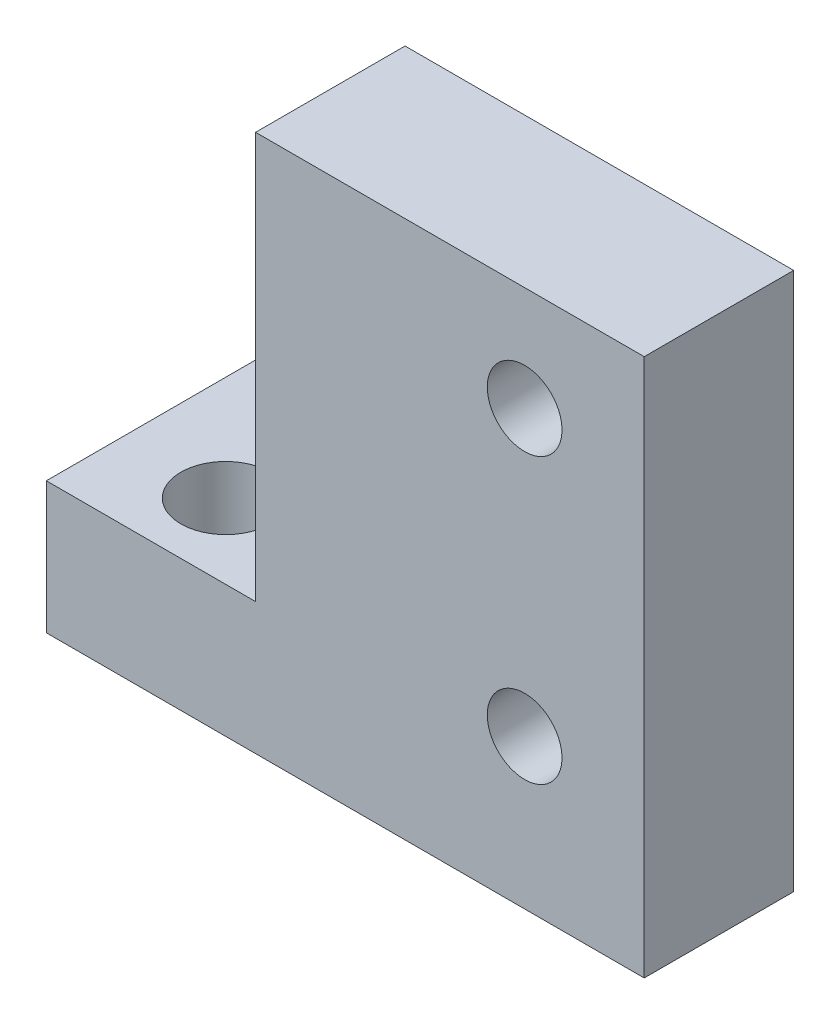
ISO-10303-21;
HEADER;
FILE_DESCRIPTION(('STEP AP214'),'2;1');
FILE_NAME('part.step','',(''),(''),'','','');
FILE_SCHEMA(('AUTOMOTIVE_DESIGN { 1 0 10303 214 1 1 1 1 }'));
ENDSEC;
DATA;
#1=APPLICATION_CONTEXT('core data for automotive mechanical design processes');
#2=APPLICATION_PROTOCOL_DEFINITION('international standard','automotive_design',2000,#1);
#3=PRODUCT_CONTEXT('',#1,'mechanical');
#4=PRODUCT('Part','Part','',(#3));
#5=PRODUCT_RELATED_PRODUCT_CATEGORY('part','',(#4));
#6=PRODUCT_DEFINITION_FORMATION('','',#4);
#7=PRODUCT_DEFINITION_CONTEXT('part definition',#1,'design');
#8=PRODUCT_DEFINITION('design','',#6,#7);
#9=PRODUCT_DEFINITION_SHAPE('','',#8);
#10=(LENGTH_UNIT() NAMED_UNIT(*) SI_UNIT(.MILLI.,.METRE.));
#11=(NAMED_UNIT(*) PLANE_ANGLE_UNIT() SI_UNIT($,.RADIAN.));
#12=(NAMED_UNIT(*) SI_UNIT($,.STERADIAN.) SOLID_ANGLE_UNIT());
#13=UNCERTAINTY_MEASURE_WITH_UNIT(LENGTH_MEASURE(1.E-05),#10,'distance_accuracy_value','');
#14=(GEOMETRIC_REPRESENTATION_CONTEXT(3) GLOBAL_UNCERTAINTY_ASSIGNED_CONTEXT((#13)) GLOBAL_UNIT_ASSIGNED_CONTEXT((#10,
#11,#12)) REPRESENTATION_CONTEXT('',''));
#15=CARTESIAN_POINT('',(0.,0.,0.));
#16=DIRECTION('',(0.,0.,1.));
#17=DIRECTION('',(1.,0.,0.));
#18=AXIS2_PLACEMENT_3D('',#15,#16,#17);
#19=CARTESIAN_POINT('',(0.,18.,0.));
#20=DIRECTION('',(-1.,0.,0.));
#21=DIRECTION('',(0.,0.,1.));
#22=AXIS2_PLACEMENT_3D('',#19,#20,#21);
#23=PLANE('',#22);
#24=DIRECTION('',(0.,0.,-1.));
#25=VECTOR('',#24,1.);
#26=CARTESIAN_POINT('',(0.,4.40436135801292,0.));
#27=LINE('',#26,#25);
#28=CARTESIAN_POINT('',(0.,4.40436135801292,-3.3180339887499));
#29=VERTEX_POINT('',#28);
#30=CARTESIAN_POINT('',(0.,4.40436135801292,-6.));
#31=VERTEX_POINT('',#30);
#32=EDGE_CURVE('E173',#29,#31,#27,.T.);
#33=ORIENTED_EDGE('',*,*,#32,.F.);
#34=DIRECTION('',(0.,-1.,0.));
#35=VECTOR('',#34,1.);
#36=CARTESIAN_POINT('',(0.,10.,-3.3180339887499));
#37=LINE('',#36,#35);
#38=CARTESIAN_POINT('',(0.,0.,-3.3180339887499));
#39=VERTEX_POINT('',#38);
#40=EDGE_CURVE('E53',#29,#39,#37,.T.);
#41=ORIENTED_EDGE('',*,*,#40,.T.);
#42=DIRECTION('',(0.,0.,-1.));
#43=VECTOR('',#42,1.);
#44=CARTESIAN_POINT('',(0.,0.,0.));
#45=LINE('',#44,#43);
#46=CARTESIAN_POINT('',(0.,0.,-6.));
#47=VERTEX_POINT('',#46);
#48=EDGE_CURVE('E111',#39,#47,#45,.T.);
#49=ORIENTED_EDGE('',*,*,#48,.T.);
#50=DIRECTION('',(0.,-1.,0.));
#51=VECTOR('',#50,1.);
#52=CARTESIAN_POINT('',(0.,18.,-6.));
#53=LINE('',#52,#51);
#54=EDGE_CURVE('E133',#31,#47,#53,.T.);
#55=ORIENTED_EDGE('',*,*,#54,.F.);
#56=EDGE_LOOP('',(#33,#41,#49,#55));
#57=FACE_BOUND('',#56,.T.);
#58=ADVANCED_FACE('F37',(#57),#23,.F.);
#59=CARTESIAN_POINT('',(0.,18.,0.));
#60=DIRECTION('',(0.,0.,1.));
#61=DIRECTION('',(1.,0.,0.));
#62=AXIS2_PLACEMENT_3D('',#59,#60,#61);
#63=PLANE('',#62);
#64=CARTESIAN_POINT('',(9.00000000000001,14.5,0.));
#65=DIRECTION('',(0.,0.,-1.));
#66=DIRECTION('',(-1.,0.,0.));
#67=AXIS2_PLACEMENT_3D('',#64,#65,#66);
#68=CIRCLE('',#67,1.25);
#69=CARTESIAN_POINT('',(7.75000000000001,14.5,0.));
#70=VERTEX_POINT('',#69);
#71=EDGE_CURVE('E204',#70,#70,#68,.T.);
#72=ORIENTED_EDGE('',*,*,#71,.F.);
#73=EDGE_LOOP('',(#72));
#74=FACE_BOUND('',#73,.T.);
#75=CARTESIAN_POINT('',(9.00000000000001,4.99999999999999,0.));
#76=DIRECTION('',(0.,0.,-1.));
#77=DIRECTION('',(-1.,0.,0.));
#78=AXIS2_PLACEMENT_3D('',#75,#76,#77);
#79=CIRCLE('',#78,1.25);
#80=CARTESIAN_POINT('',(7.75000000000001,4.99999999999999,0.));
#81=VERTEX_POINT('',#80);
#82=EDGE_CURVE('E198',#81,#81,#79,.T.);
#83=ORIENTED_EDGE('',*,*,#82,.F.);
#84=EDGE_LOOP('',(#83));
#85=FACE_BOUND('',#84,.T.);
#86=DIRECTION('',(0.,-1.,0.));
#87=VECTOR('',#86,1.);
#88=CARTESIAN_POINT('',(0.,18.,0.));
#89=LINE('',#88,#87);
#90=CARTESIAN_POINT('',(0.,4.40436135801292,0.));
#91=VERTEX_POINT('',#90);
#92=CARTESIAN_POINT('',(0.,0.,0.));
#93=VERTEX_POINT('',#92);
#94=EDGE_CURVE('E136',#91,#93,#89,.T.);
#95=ORIENTED_EDGE('',*,*,#94,.F.);
#96=DIRECTION('',(0.,-1.,0.));
#97=VECTOR('',#96,1.);
#98=CARTESIAN_POINT('',(0.,4.40436135801292,0.));
#99=LINE('',#98,#97);
#100=CARTESIAN_POINT('',(0.,18.,0.));
#101=VERTEX_POINT('',#100);
#102=EDGE_CURVE('E177',#101,#91,#99,.T.);
#103=ORIENTED_EDGE('',*,*,#102,.F.);
#104=DIRECTION('',(-1.,0.,0.));
#105=VECTOR('',#104,1.);
#106=CARTESIAN_POINT('',(0.,18.,0.));
#107=LINE('',#106,#105);
#108=CARTESIAN_POINT('',(13.,18.,0.));
#109=VERTEX_POINT('',#108);
#110=EDGE_CURVE('E96',#109,#101,#107,.T.);
#111=ORIENTED_EDGE('',*,*,#110,.F.);
#112=DIRECTION('',(0.,-1.,0.));
#113=VECTOR('',#112,1.);
#114=CARTESIAN_POINT('',(13.,18.,0.));
#115=LINE('',#114,#113);
#116=CARTESIAN_POINT('',(13.,0.,0.));
#117=VERTEX_POINT('',#116);
#118=EDGE_CURVE('E89',#109,#117,#115,.T.);
#119=ORIENTED_EDGE('',*,*,#118,.T.);
#120=DIRECTION('',(-1.,0.,0.));
#121=VECTOR('',#120,1.);
#122=CARTESIAN_POINT('',(0.,0.,0.));
#123=LINE('',#122,#121);
#124=EDGE_CURVE('E102',#117,#93,#123,.T.);
#125=ORIENTED_EDGE('',*,*,#124,.T.);
#126=EDGE_LOOP('',(#95,#103,#111,#119,#125));
#127=FACE_BOUND('',#126,.T.);
#128=ADVANCED_FACE('F39',(#74,#85,#127),#63,.F.);
#129=CARTESIAN_POINT('',(0.,0.,-1.08196601125011));
#130=VERTEX_POINT('',#129);
#131=EDGE_CURVE('E110',#93,#130,#45,.T.);
#132=ORIENTED_EDGE('',*,*,#131,.T.);
#133=DIRECTION('',(0.,-1.,0.));
#134=VECTOR('',#133,1.);
#135=CARTESIAN_POINT('',(0.,10.,-1.08196601125011));
#136=LINE('',#135,#134);
#137=CARTESIAN_POINT('',(0.,4.40436135801292,-1.08196601125011));
#138=VERTEX_POINT('',#137);
#139=EDGE_CURVE('E181',#130,#138,#136,.F.);
#140=ORIENTED_EDGE('',*,*,#139,.T.);
#141=EDGE_CURVE('E116',#91,#138,#27,.T.);
#142=ORIENTED_EDGE('',*,*,#141,.F.);
#143=ORIENTED_EDGE('',*,*,#94,.T.);
#144=EDGE_LOOP('',(#132,#140,#142,#143));
#145=FACE_BOUND('',#144,.T.);
#146=ADVANCED_FACE('F213',(#145),#23,.F.);
#147=CARTESIAN_POINT('',(0.,18.,-6.));
#148=DIRECTION('',(0.,0.,1.));
#149=DIRECTION('',(1.,0.,0.));
#150=AXIS2_PLACEMENT_3D('',#147,#148,#149);
#151=PLANE('',#150);
#152=DIRECTION('',(0.,-1.,0.));
#153=VECTOR('',#152,1.);
#154=CARTESIAN_POINT('',(-7.,18.,-6.));
#155=LINE('',#154,#153);
#156=CARTESIAN_POINT('',(-7.,4.40436135801292,-6.));
#157=VERTEX_POINT('',#156);
#158=CARTESIAN_POINT('',(-7.,0.,-6.));
#159=VERTEX_POINT('',#158);
#160=EDGE_CURVE('E131',#157,#159,#155,.T.);
#161=ORIENTED_EDGE('',*,*,#160,.F.);
#162=DIRECTION('',(1.,0.,0.));
#163=VECTOR('',#162,1.);
#164=CARTESIAN_POINT('',(-10.,4.40436135801292,-6.));
#165=LINE('',#164,#163);
#166=EDGE_CURVE('E112',#157,#31,#165,.T.);
#167=ORIENTED_EDGE('',*,*,#166,.T.);
#168=ORIENTED_EDGE('',*,*,#54,.T.);
#169=DIRECTION('',(-1.,0.,0.));
#170=VECTOR('',#169,1.);
#171=CARTESIAN_POINT('',(0.,0.,-6.));
#172=LINE('',#171,#170);
#173=EDGE_CURVE('E121',#47,#159,#172,.T.);
#174=ORIENTED_EDGE('',*,*,#173,.T.);
#175=EDGE_LOOP('',(#161,#167,#168,#174));
#176=FACE_BOUND('',#175,.T.);
#177=ADVANCED_FACE('F233',(#176),#151,.F.);
#178=CARTESIAN_POINT('',(-7.,18.,-6.));
#179=DIRECTION('',(1.,0.,0.));
#180=DIRECTION('',(0.,0.,-1.));
#181=AXIS2_PLACEMENT_3D('',#178,#179,#180);
#182=PLANE('',#181);
#183=DIRECTION('',(0.,-1.,0.));
#184=VECTOR('',#183,1.);
#185=CARTESIAN_POINT('',(-7.,18.,5.));
#186=LINE('',#185,#184);
#187=CARTESIAN_POINT('',(-7.,4.40436135801292,5.));
#188=VERTEX_POINT('',#187);
#189=CARTESIAN_POINT('',(-7.,0.,5.));
#190=VERTEX_POINT('',#189);
#191=EDGE_CURVE('E129',#188,#190,#186,.T.);
#192=ORIENTED_EDGE('',*,*,#191,.F.);
#193=DIRECTION('',(0.,0.,-1.));
#194=VECTOR('',#193,1.);
#195=CARTESIAN_POINT('',(-7.,4.40436135801292,-6.));
#196=LINE('',#195,#194);
#197=EDGE_CURVE('E138',#188,#157,#196,.T.);
#198=ORIENTED_EDGE('',*,*,#197,.T.);
#199=ORIENTED_EDGE('',*,*,#160,.T.);
#200=DIRECTION('',(0.,0.,1.));
#201=VECTOR('',#200,1.);
#202=CARTESIAN_POINT('',(-7.,0.,-6.));
#203=LINE('',#202,#201);
#204=EDGE_CURVE('E124',#159,#190,#203,.T.);
#205=ORIENTED_EDGE('',*,*,#204,.T.);
#206=EDGE_LOOP('',(#192,#198,#199,#205));
#207=FACE_BOUND('',#206,.T.);
#208=ADVANCED_FACE('F163',(#207),#182,.F.);
#209=CARTESIAN_POINT('',(-7.,18.,5.));
#210=DIRECTION('',(0.,0.,-1.));
#211=DIRECTION('',(-1.,0.,0.));
#212=AXIS2_PLACEMENT_3D('',#209,#210,#211);
#213=PLANE('',#212);
#214=CARTESIAN_POINT('',(9.00000000000001,14.5,5.));
#215=DIRECTION('',(0.,0.,-1.));
#216=DIRECTION('',(-1.,0.,0.));
#217=AXIS2_PLACEMENT_3D('',#214,#215,#216);
#218=CIRCLE('',#217,1.25);
#219=CARTESIAN_POINT('',(7.75000000000001,14.5,5.));
#220=VERTEX_POINT('',#219);
#221=EDGE_CURVE('E201',#220,#220,#218,.T.);
#222=ORIENTED_EDGE('',*,*,#221,.T.);
#223=EDGE_LOOP('',(#222));
#224=FACE_BOUND('',#223,.T.);
#225=CARTESIAN_POINT('',(9.00000000000001,4.99999999999999,5.));
#226=DIRECTION('',(0.,0.,-1.));
#227=DIRECTION('',(-1.,0.,0.));
#228=AXIS2_PLACEMENT_3D('',#225,#226,#227);
#229=CIRCLE('',#228,1.25);
#230=CARTESIAN_POINT('',(7.75000000000001,4.99999999999999,5.));
#231=VERTEX_POINT('',#230);
#232=EDGE_CURVE('E41',#231,#231,#229,.T.);
#233=ORIENTED_EDGE('',*,*,#232,.T.);
#234=EDGE_LOOP('',(#233));
#235=FACE_BOUND('',#234,.T.);
#236=DIRECTION('',(1.,0.,0.));
#237=VECTOR('',#236,1.);
#238=CARTESIAN_POINT('',(-7.,18.,5.));
#239=LINE('',#238,#237);
#240=CARTESIAN_POINT('',(0.,18.,5.));
#241=VERTEX_POINT('',#240);
#242=CARTESIAN_POINT('',(13.,18.,5.));
#243=VERTEX_POINT('',#242);
#244=EDGE_CURVE('E167',#241,#243,#239,.T.);
#245=ORIENTED_EDGE('',*,*,#244,.F.);
#246=DIRECTION('',(0.,-1.,0.));
#247=VECTOR('',#246,1.);
#248=CARTESIAN_POINT('',(0.,18.,5.));
#249=LINE('',#248,#247);
#250=CARTESIAN_POINT('',(0.,4.40436135801292,5.));
#251=VERTEX_POINT('',#250);
#252=EDGE_CURVE('E154',#241,#251,#249,.T.);
#253=ORIENTED_EDGE('',*,*,#252,.T.);
#254=DIRECTION('',(-1.,0.,0.));
#255=VECTOR('',#254,1.);
#256=CARTESIAN_POINT('',(-7.,4.40436135801292,5.));
#257=LINE('',#256,#255);
#258=EDGE_CURVE('E46',#251,#188,#257,.T.);
#259=ORIENTED_EDGE('',*,*,#258,.T.);
#260=ORIENTED_EDGE('',*,*,#191,.T.);
#261=DIRECTION('',(1.,0.,0.));
#262=VECTOR('',#261,1.);
#263=CARTESIAN_POINT('',(-7.,0.,5.));
#264=LINE('',#263,#262);
#265=CARTESIAN_POINT('',(13.,0.,5.));
#266=VERTEX_POINT('',#265);
#267=EDGE_CURVE('E97',#190,#266,#264,.T.);
#268=ORIENTED_EDGE('',*,*,#267,.T.);
#269=DIRECTION('',(0.,-1.,0.));
#270=VECTOR('',#269,1.);
#271=CARTESIAN_POINT('',(13.,18.,5.));
#272=LINE('',#271,#270);
#273=EDGE_CURVE('E92',#243,#266,#272,.T.);
#274=ORIENTED_EDGE('',*,*,#273,.F.);
#275=EDGE_LOOP('',(#245,#253,#259,#260,#268,#274));
#276=FACE_BOUND('',#275,.T.);
#277=ADVANCED_FACE('F151',(#224,#235,#276),#213,.F.);
#278=CARTESIAN_POINT('',(13.,18.,5.));
#279=DIRECTION('',(-1.,0.,0.));
#280=DIRECTION('',(0.,0.,1.));
#281=AXIS2_PLACEMENT_3D('',#278,#279,#280);
#282=PLANE('',#281);
#283=DIRECTION('',(0.,0.,-1.));
#284=VECTOR('',#283,1.);
#285=CARTESIAN_POINT('',(13.,0.,5.));
#286=LINE('',#285,#284);
#287=EDGE_CURVE('E86',#266,#117,#286,.T.);
#288=ORIENTED_EDGE('',*,*,#287,.T.);
#289=ORIENTED_EDGE('',*,*,#118,.F.);
#290=DIRECTION('',(0.,0.,-1.));
#291=VECTOR('',#290,1.);
#292=CARTESIAN_POINT('',(13.,18.,5.));
#293=LINE('',#292,#291);
#294=EDGE_CURVE('E61',#243,#109,#293,.T.);
#295=ORIENTED_EDGE('',*,*,#294,.F.);
#296=ORIENTED_EDGE('',*,*,#273,.T.);
#297=EDGE_LOOP('',(#288,#289,#295,#296));
#298=FACE_BOUND('',#297,.T.);
#299=ADVANCED_FACE('F88',(#298),#282,.F.);
#300=CARTESIAN_POINT('',(0.,18.,0.));
#301=DIRECTION('',(0.,1.,0.));
#302=DIRECTION('',(0.,0.,1.));
#303=AXIS2_PLACEMENT_3D('',#300,#301,#302);
#304=PLANE('',#303);
#305=DIRECTION('',(0.,0.,-1.));
#306=VECTOR('',#305,1.);
#307=CARTESIAN_POINT('',(0.,18.,0.));
#308=LINE('',#307,#306);
#309=EDGE_CURVE('E141',#241,#101,#308,.T.);
#310=ORIENTED_EDGE('',*,*,#309,.F.);
#311=ORIENTED_EDGE('',*,*,#244,.T.);
#312=ORIENTED_EDGE('',*,*,#294,.T.);
#313=ORIENTED_EDGE('',*,*,#110,.T.);
#314=EDGE_LOOP('',(#310,#311,#312,#313));
#315=FACE_BOUND('',#314,.T.);
#316=ADVANCED_FACE('F231',(#315),#304,.T.);
#317=CARTESIAN_POINT('',(0.,0.,0.));
#318=DIRECTION('',(0.,1.,0.));
#319=DIRECTION('',(0.,0.,1.));
#320=AXIS2_PLACEMENT_3D('',#317,#318,#319);
#321=PLANE('',#320);
#322=CARTESIAN_POINT('',(3.3,0.,2.5));
#323=DIRECTION('',(0.,-1.,0.));
#324=DIRECTION('',(0.,0.,-1.));
#325=AXIS2_PLACEMENT_3D('',#322,#323,#324);
#326=CIRCLE('',#325,1.5);
#327=CARTESIAN_POINT('',(3.3,0.,1.));
#328=VERTEX_POINT('',#327);
#329=EDGE_CURVE('E195',#328,#328,#326,.T.);
#330=ORIENTED_EDGE('',*,*,#329,.F.);
#331=EDGE_LOOP('',(#330));
#332=FACE_BOUND('',#331,.T.);
#333=CARTESIAN_POINT('',(-3.5,0.,2.5));
#334=DIRECTION('',(0.,-1.,0.));
#335=DIRECTION('',(0.,0.,-1.));
#336=AXIS2_PLACEMENT_3D('',#333,#334,#335);
#337=CIRCLE('',#336,1.5);
#338=CARTESIAN_POINT('',(-3.5,0.,1.));
#339=VERTEX_POINT('',#338);
#340=EDGE_CURVE('E189',#339,#339,#337,.T.);
#341=ORIENTED_EDGE('',*,*,#340,.F.);
#342=EDGE_LOOP('',(#341));
#343=FACE_BOUND('',#342,.T.);
#344=ORIENTED_EDGE('',*,*,#48,.F.);
#345=CARTESIAN_POINT('',(-1.,0.,-2.2));
#346=DIRECTION('',(0.,-1.,0.));
#347=DIRECTION('',(0.,0.,-1.));
#348=AXIS2_PLACEMENT_3D('',#345,#346,#347);
#349=CIRCLE('',#348,1.5);
#350=EDGE_CURVE('E184',#130,#39,#349,.T.);
#351=ORIENTED_EDGE('',*,*,#350,.F.);
#352=ORIENTED_EDGE('',*,*,#131,.F.);
#353=ORIENTED_EDGE('',*,*,#124,.F.);
#354=ORIENTED_EDGE('',*,*,#287,.F.);
#355=ORIENTED_EDGE('',*,*,#267,.F.);
#356=ORIENTED_EDGE('',*,*,#204,.F.);
#357=ORIENTED_EDGE('',*,*,#173,.F.);
#358=EDGE_LOOP('',(#344,#351,#352,#353,#354,#355,#356,#357));
#359=FACE_BOUND('',#358,.T.);
#360=ADVANCED_FACE('F107',(#332,#343,#359),#321,.F.);
#361=CARTESIAN_POINT('',(-10.,4.40436135801292,0.));
#362=DIRECTION('',(0.,-1.,0.));
#363=DIRECTION('',(0.,0.,-1.));
#364=AXIS2_PLACEMENT_3D('',#361,#362,#363);
#365=PLANE('',#364);
#366=CARTESIAN_POINT('',(-3.5,4.40436135801292,2.5));
#367=DIRECTION('',(0.,-1.,0.));
#368=DIRECTION('',(0.,0.,-1.));
#369=AXIS2_PLACEMENT_3D('',#366,#367,#368);
#370=CIRCLE('',#369,1.5);
#371=CARTESIAN_POINT('',(-3.5,4.40436135801292,1.));
#372=VERTEX_POINT('',#371);
#373=EDGE_CURVE('E186',#372,#372,#370,.T.);
#374=ORIENTED_EDGE('',*,*,#373,.T.);
#375=EDGE_LOOP('',(#374));
#376=FACE_BOUND('',#375,.T.);
#377=ORIENTED_EDGE('',*,*,#141,.T.);
#378=CARTESIAN_POINT('',(-1.,4.40436135801292,-2.2));
#379=DIRECTION('',(0.,-1.,0.));
#380=DIRECTION('',(0.,0.,-1.));
#381=AXIS2_PLACEMENT_3D('',#378,#379,#380);
#382=CIRCLE('',#381,1.5);
#383=EDGE_CURVE('E11',#138,#29,#382,.T.);
#384=ORIENTED_EDGE('',*,*,#383,.T.);
#385=ORIENTED_EDGE('',*,*,#32,.T.);
#386=ORIENTED_EDGE('',*,*,#166,.F.);
#387=ORIENTED_EDGE('',*,*,#197,.F.);
#388=ORIENTED_EDGE('',*,*,#258,.F.);
#389=DIRECTION('',(0.,0.,-1.));
#390=VECTOR('',#389,1.);
#391=CARTESIAN_POINT('',(0.,4.40436135801292,10.));
#392=LINE('',#391,#390);
#393=EDGE_CURVE('E175',#251,#91,#392,.T.);
#394=ORIENTED_EDGE('',*,*,#393,.T.);
#395=EDGE_LOOP('',(#377,#384,#385,#386,#387,#388,#394));
#396=FACE_BOUND('',#395,.T.);
#397=ADVANCED_FACE('F264',(#376,#396),#365,.F.);
#398=CARTESIAN_POINT('',(0.,4.40436135801292,10.));
#399=DIRECTION('',(1.,0.,0.));
#400=DIRECTION('',(0.,0.,-1.));
#401=AXIS2_PLACEMENT_3D('',#398,#399,#400);
#402=PLANE('',#401);
#403=ORIENTED_EDGE('',*,*,#309,.T.);
#404=ORIENTED_EDGE('',*,*,#102,.T.);
#405=ORIENTED_EDGE('',*,*,#393,.F.);
#406=ORIENTED_EDGE('',*,*,#252,.F.);
#407=EDGE_LOOP('',(#403,#404,#405,#406));
#408=FACE_BOUND('',#407,.T.);
#409=ADVANCED_FACE('F269',(#408),#402,.F.);
#410=CARTESIAN_POINT('',(-1.,10.,-2.2));
#411=DIRECTION('',(0.,-1.,0.));
#412=DIRECTION('',(0.,0.,-1.));
#413=AXIS2_PLACEMENT_3D('',#410,#411,#412);
#414=CYLINDRICAL_SURFACE('',#413,1.5);
#415=ORIENTED_EDGE('',*,*,#383,.F.);
#416=ORIENTED_EDGE('',*,*,#139,.F.);
#417=ORIENTED_EDGE('',*,*,#350,.T.);
#418=ORIENTED_EDGE('',*,*,#40,.F.);
#419=EDGE_LOOP('',(#415,#416,#417,#418));
#420=FACE_BOUND('',#419,.T.);
#421=ADVANCED_FACE('F266',(#420),#414,.F.);
#422=CARTESIAN_POINT('',(-3.5,0.,2.5));
#423=DIRECTION('',(0.,-1.,0.));
#424=DIRECTION('',(0.,0.,-1.));
#425=AXIS2_PLACEMENT_3D('',#422,#423,#424);
#426=CYLINDRICAL_SURFACE('',#425,1.5);
#427=ORIENTED_EDGE('',*,*,#340,.T.);
#428=EDGE_LOOP('',(#427));
#429=FACE_BOUND('',#428,.T.);
#430=ORIENTED_EDGE('',*,*,#373,.F.);
#431=EDGE_LOOP('',(#430));
#432=FACE_BOUND('',#431,.T.);
#433=ADVANCED_FACE('F268',(#429,#432),#426,.F.);
#434=CARTESIAN_POINT('',(3.3,5.,2.5));
#435=DIRECTION('',(0.,1.,0.));
#436=DIRECTION('',(0.,0.,1.));
#437=AXIS2_PLACEMENT_3D('',#434,#435,#436);
#438=PLANE('',#437);
#439=CARTESIAN_POINT('',(3.3,5.,2.5));
#440=DIRECTION('',(0.,-1.,0.));
#441=DIRECTION('',(0.,0.,-1.));
#442=AXIS2_PLACEMENT_3D('',#439,#440,#441);
#443=CIRCLE('',#442,1.5);
#444=CARTESIAN_POINT('',(3.3,5.,1.));
#445=VERTEX_POINT('',#444);
#446=EDGE_CURVE('E192',#445,#445,#443,.T.);
#447=ORIENTED_EDGE('',*,*,#446,.T.);
#448=EDGE_LOOP('',(#447));
#449=FACE_BOUND('',#448,.T.);
#450=ADVANCED_FACE('F275',(#449),#438,.F.);
#451=CARTESIAN_POINT('',(3.3,0.,2.5));
#452=DIRECTION('',(0.,-1.,0.));
#453=DIRECTION('',(0.,0.,-1.));
#454=AXIS2_PLACEMENT_3D('',#451,#452,#453);
#455=CYLINDRICAL_SURFACE('',#454,1.5);
#456=ORIENTED_EDGE('',*,*,#446,.F.);
#457=EDGE_LOOP('',(#456));
#458=FACE_BOUND('',#457,.T.);
#459=ORIENTED_EDGE('',*,*,#329,.T.);
#460=EDGE_LOOP('',(#459));
#461=FACE_BOUND('',#460,.T.);
#462=ADVANCED_FACE('F219',(#458,#461),#455,.F.);
#463=CARTESIAN_POINT('',(9.00000000000001,4.99999999999999,0.));
#464=DIRECTION('',(0.,0.,-1.));
#465=DIRECTION('',(-1.,0.,0.));
#466=AXIS2_PLACEMENT_3D('',#463,#464,#465);
#467=CYLINDRICAL_SURFACE('',#466,1.25);
#468=ORIENTED_EDGE('',*,*,#82,.T.);
#469=EDGE_LOOP('',(#468));
#470=FACE_BOUND('',#469,.T.);
#471=ORIENTED_EDGE('',*,*,#232,.F.);
#472=EDGE_LOOP('',(#471));
#473=FACE_BOUND('',#472,.T.);
#474=ADVANCED_FACE('F216',(#470,#473),#467,.F.);
#475=CARTESIAN_POINT('',(9.00000000000001,14.5,0.));
#476=DIRECTION('',(0.,0.,-1.));
#477=DIRECTION('',(-1.,0.,0.));
#478=AXIS2_PLACEMENT_3D('',#475,#476,#477);
#479=CYLINDRICAL_SURFACE('',#478,1.25);
#480=ORIENTED_EDGE('',*,*,#71,.T.);
#481=EDGE_LOOP('',(#480));
#482=FACE_BOUND('',#481,.T.);
#483=ORIENTED_EDGE('',*,*,#221,.F.);
#484=EDGE_LOOP('',(#483));
#485=FACE_BOUND('',#484,.T.);
#486=ADVANCED_FACE('F208',(#482,#485),#479,.F.);
#487=CLOSED_SHELL('',(#58,#128,#146,#177,#208,#277,#299,#316,#360,#397,#409,#421,#433,#450,#462,
#474,#486));
#488=MANIFOLD_SOLID_BREP('B2',#487);
#489=ADVANCED_BREP_SHAPE_REPRESENTATION('',(#18,#488),#14);
#490=SHAPE_DEFINITION_REPRESENTATION(#9,#489);
ENDSEC;
END-ISO-10303-21;
